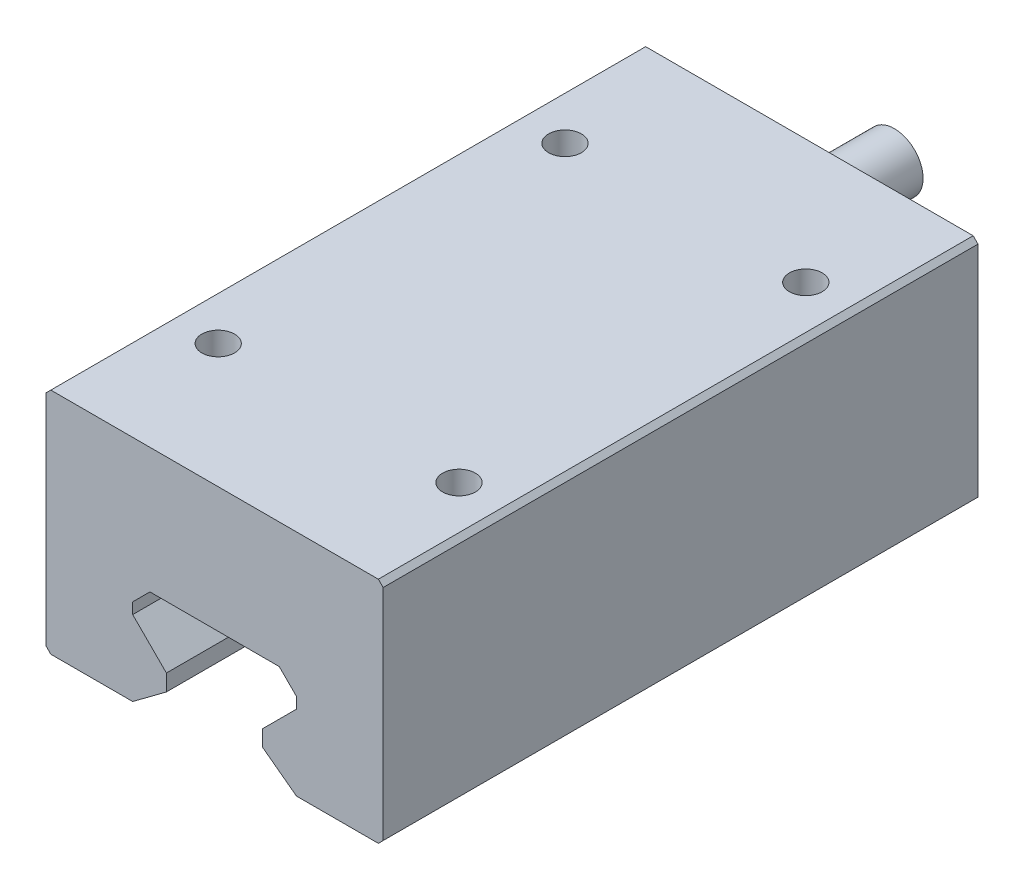
ISO-10303-21;
HEADER;
FILE_DESCRIPTION(('STEP AP214'),'2;1');
FILE_NAME('part.step','',(''),(''),'','','');
FILE_SCHEMA(('AUTOMOTIVE_DESIGN { 1 0 10303 214 1 1 1 1 }'));
ENDSEC;
DATA;
#1=APPLICATION_CONTEXT('core data for automotive mechanical design processes');
#2=APPLICATION_PROTOCOL_DEFINITION('international standard','automotive_design',2000,#1);
#3=PRODUCT_CONTEXT('',#1,'mechanical');
#4=PRODUCT('Part','Part','',(#3));
#5=PRODUCT_RELATED_PRODUCT_CATEGORY('part','',(#4));
#6=PRODUCT_DEFINITION_FORMATION('','',#4);
#7=PRODUCT_DEFINITION_CONTEXT('part definition',#1,'design');
#8=PRODUCT_DEFINITION('design','',#6,#7);
#9=PRODUCT_DEFINITION_SHAPE('','',#8);
#10=(LENGTH_UNIT() NAMED_UNIT(*) SI_UNIT(.MILLI.,.METRE.));
#11=(NAMED_UNIT(*) PLANE_ANGLE_UNIT() SI_UNIT($,.RADIAN.));
#12=(NAMED_UNIT(*) SI_UNIT($,.STERADIAN.) SOLID_ANGLE_UNIT());
#13=UNCERTAINTY_MEASURE_WITH_UNIT(LENGTH_MEASURE(1.E-05),#10,'distance_accuracy_value','');
#14=(GEOMETRIC_REPRESENTATION_CONTEXT(3) GLOBAL_UNCERTAINTY_ASSIGNED_CONTEXT((#13)) GLOBAL_UNIT_ASSIGNED_CONTEXT((#10,
#11,#12)) REPRESENTATION_CONTEXT('',''));
#15=CARTESIAN_POINT('',(0.,0.,0.));
#16=DIRECTION('',(0.,0.,1.));
#17=DIRECTION('',(1.,0.,0.));
#18=AXIS2_PLACEMENT_3D('',#15,#16,#17);
#19=CARTESIAN_POINT('',(10.,29.,0.));
#20=DIRECTION('',(0.,0.,-1.));
#21=DIRECTION('',(-1.,0.,0.));
#22=AXIS2_PLACEMENT_3D('',#19,#20,#21);
#23=PLANE('',#22);
#24=DIRECTION('',(0.,-1.,0.));
#25=VECTOR('',#24,1.);
#26=CARTESIAN_POINT('',(-35.,7.49999999999999,0.));
#27=LINE('',#26,#25);
#28=CARTESIAN_POINT('',(-35.,54.,0.));
#29=VERTEX_POINT('',#28);
#30=CARTESIAN_POINT('',(-35.,8.49999999999999,0.));
#31=VERTEX_POINT('',#30);
#32=EDGE_CURVE('E281',#29,#31,#27,.T.);
#33=ORIENTED_EDGE('',*,*,#32,.F.);
#34=DIRECTION('',(-0.707106781186548,-0.707106781186548,0.));
#35=VECTOR('',#34,1.);
#36=CARTESIAN_POINT('',(-25.,64.,0.));
#37=LINE('',#36,#35);
#38=CARTESIAN_POINT('',(-34.,55.,0.));
#39=VERTEX_POINT('',#38);
#40=EDGE_CURVE('E341',#29,#39,#37,.F.);
#41=ORIENTED_EDGE('',*,*,#40,.T.);
#42=DIRECTION('',(-1.,0.,0.));
#43=VECTOR('',#42,1.);
#44=CARTESIAN_POINT('',(-35.,55.,0.));
#45=LINE('',#44,#43);
#46=CARTESIAN_POINT('',(34.,55.,0.));
#47=VERTEX_POINT('',#46);
#48=EDGE_CURVE('E278',#47,#39,#45,.T.);
#49=ORIENTED_EDGE('',*,*,#48,.F.);
#50=DIRECTION('',(-0.707106781186548,0.707106781186548,0.));
#51=VECTOR('',#50,1.);
#52=CARTESIAN_POINT('',(35.,54.,0.));
#53=LINE('',#52,#51);
#54=CARTESIAN_POINT('',(35.,54.,0.));
#55=VERTEX_POINT('',#54);
#56=EDGE_CURVE('E335',#47,#55,#53,.F.);
#57=ORIENTED_EDGE('',*,*,#56,.T.);
#58=DIRECTION('',(0.,1.,0.));
#59=VECTOR('',#58,1.);
#60=CARTESIAN_POINT('',(35.,55.,0.));
#61=LINE('',#60,#59);
#62=CARTESIAN_POINT('',(35.,8.49999999999999,0.));
#63=VERTEX_POINT('',#62);
#64=EDGE_CURVE('E276',#63,#55,#61,.T.);
#65=ORIENTED_EDGE('',*,*,#64,.F.);
#66=DIRECTION('',(0.707106781186553,0.707106781186542,0.));
#67=VECTOR('',#66,1.);
#68=CARTESIAN_POINT('',(32.7499999999998,6.24999999999984,0.));
#69=LINE('',#68,#67);
#70=CARTESIAN_POINT('',(34.,7.5,0.));
#71=VERTEX_POINT('',#70);
#72=EDGE_CURVE('E337',#63,#71,#69,.F.);
#73=ORIENTED_EDGE('',*,*,#72,.T.);
#74=DIRECTION('',(1.,0.,0.));
#75=VECTOR('',#74,1.);
#76=CARTESIAN_POINT('',(35.,7.5,0.));
#77=LINE('',#76,#75);
#78=CARTESIAN_POINT('',(17.,7.5,0.));
#79=VERTEX_POINT('',#78);
#80=EDGE_CURVE('E273',#79,#71,#77,.T.);
#81=ORIENTED_EDGE('',*,*,#80,.F.);
#82=DIRECTION('',(0.801570617283295,-0.597900113320008,0.));
#83=VECTOR('',#82,1.);
#84=CARTESIAN_POINT('',(17.,7.5,0.));
#85=LINE('',#84,#83);
#86=CARTESIAN_POINT('',(10.,12.7213750142501,0.));
#87=VERTEX_POINT('',#86);
#88=EDGE_CURVE('E271',#87,#79,#85,.T.);
#89=ORIENTED_EDGE('',*,*,#88,.F.);
#90=DIRECTION('',(0.,-1.,0.));
#91=VECTOR('',#90,1.);
#92=CARTESIAN_POINT('',(10.,12.7213750142501,0.));
#93=LINE('',#92,#91);
#94=CARTESIAN_POINT('',(10.,16.1299077981946,0.));
#95=VERTEX_POINT('',#94);
#96=EDGE_CURVE('E269',#95,#87,#93,.T.);
#97=ORIENTED_EDGE('',*,*,#96,.F.);
#98=DIRECTION('',(-0.70710678118655,-0.707106781186546,0.));
#99=VECTOR('',#98,1.);
#100=CARTESIAN_POINT('',(10.,16.1299077981946,0.));
#101=LINE('',#100,#99);
#102=CARTESIAN_POINT('',(17.,23.1299077981945,0.));
#103=VERTEX_POINT('',#102);
#104=EDGE_CURVE('E267',#103,#95,#101,.T.);
#105=ORIENTED_EDGE('',*,*,#104,.F.);
#106=DIRECTION('',(0.,-1.,0.));
#107=VECTOR('',#106,1.);
#108=CARTESIAN_POINT('',(17.,23.1299077981945,0.));
#109=LINE('',#108,#107);
#110=CARTESIAN_POINT('',(17.,25.4259062998612,0.));
#111=VERTEX_POINT('',#110);
#112=EDGE_CURVE('E265',#111,#103,#109,.T.);
#113=ORIENTED_EDGE('',*,*,#112,.F.);
#114=DIRECTION('',(0.70710678118655,-0.707106781186545,0.));
#115=VECTOR('',#114,1.);
#116=CARTESIAN_POINT('',(17.,25.4259062998612,0.));
#117=LINE('',#116,#115);
#118=CARTESIAN_POINT('',(13.4259062998612,29.,0.));
#119=VERTEX_POINT('',#118);
#120=EDGE_CURVE('E263',#119,#111,#117,.T.);
#121=ORIENTED_EDGE('',*,*,#120,.F.);
#122=DIRECTION('',(1.,0.,0.));
#123=VECTOR('',#122,1.);
#124=CARTESIAN_POINT('',(13.4259062998612,29.,0.));
#125=LINE('',#124,#123);
#126=CARTESIAN_POINT('',(-13.4259062998611,29.,0.));
#127=VERTEX_POINT('',#126);
#128=EDGE_CURVE('E223',#127,#119,#125,.T.);
#129=ORIENTED_EDGE('',*,*,#128,.F.);
#130=DIRECTION('',(0.707106781186553,0.707106781186542,0.));
#131=VECTOR('',#130,1.);
#132=CARTESIAN_POINT('',(-13.4259062998611,29.,0.));
#133=LINE('',#132,#131);
#134=CARTESIAN_POINT('',(-17.,25.4259062998612,0.));
#135=VERTEX_POINT('',#134);
#136=EDGE_CURVE('E228',#135,#127,#133,.T.);
#137=ORIENTED_EDGE('',*,*,#136,.F.);
#138=DIRECTION('',(0.,1.,0.));
#139=VECTOR('',#138,1.);
#140=CARTESIAN_POINT('',(-17.,25.4259062998612,0.));
#141=LINE('',#140,#139);
#142=CARTESIAN_POINT('',(-17.,23.1299077981946,0.));
#143=VERTEX_POINT('',#142);
#144=EDGE_CURVE('E292',#143,#135,#141,.T.);
#145=ORIENTED_EDGE('',*,*,#144,.F.);
#146=DIRECTION('',(-0.707106781186548,0.707106781186547,0.));
#147=VECTOR('',#146,1.);
#148=CARTESIAN_POINT('',(-17.,23.1299077981946,0.));
#149=LINE('',#148,#147);
#150=CARTESIAN_POINT('',(-10.,16.1299077981946,0.));
#151=VERTEX_POINT('',#150);
#152=EDGE_CURVE('E290',#151,#143,#149,.T.);
#153=ORIENTED_EDGE('',*,*,#152,.F.);
#154=DIRECTION('',(0.,1.,0.));
#155=VECTOR('',#154,1.);
#156=CARTESIAN_POINT('',(-10.,16.1299077981946,0.));
#157=LINE('',#156,#155);
#158=CARTESIAN_POINT('',(-10.,12.7213750142501,0.));
#159=VERTEX_POINT('',#158);
#160=EDGE_CURVE('E288',#159,#151,#157,.T.);
#161=ORIENTED_EDGE('',*,*,#160,.F.);
#162=DIRECTION('',(0.801570617283295,0.597900113320008,0.));
#163=VECTOR('',#162,1.);
#164=CARTESIAN_POINT('',(-10.,12.7213750142501,0.));
#165=LINE('',#164,#163);
#166=CARTESIAN_POINT('',(-17.,7.5,0.));
#167=VERTEX_POINT('',#166);
#168=EDGE_CURVE('E286',#167,#159,#165,.T.);
#169=ORIENTED_EDGE('',*,*,#168,.F.);
#170=DIRECTION('',(1.,0.,0.));
#171=VECTOR('',#170,1.);
#172=CARTESIAN_POINT('',(-17.,7.5,0.));
#173=LINE('',#172,#171);
#174=CARTESIAN_POINT('',(-34.,7.49999999999999,0.));
#175=VERTEX_POINT('',#174);
#176=EDGE_CURVE('E284',#175,#167,#173,.T.);
#177=ORIENTED_EDGE('',*,*,#176,.F.);
#178=DIRECTION('',(0.707106781186548,-0.707106781186548,0.));
#179=VECTOR('',#178,1.);
#180=CARTESIAN_POINT('',(-22.75,-3.75000000000003,0.));
#181=LINE('',#180,#179);
#182=EDGE_CURVE('E339',#175,#31,#181,.F.);
#183=ORIENTED_EDGE('',*,*,#182,.T.);
#184=EDGE_LOOP('',(#33,#41,#49,#57,#65,#73,#81,#89,#97,#105,#113,#121,#129,#137,#145,#153,#161,
#169,#177,#183));
#185=FACE_BOUND('',#184,.T.);
#186=CARTESIAN_POINT('',(2.03758314148672,44.5184659444919,0.));
#187=DIRECTION('',(0.,0.,-1.));
#188=DIRECTION('',(-1.,0.,0.));
#189=AXIS2_PLACEMENT_3D('',#186,#187,#188);
#190=CIRCLE('',#189,5.96145320089348);
#191=CARTESIAN_POINT('',(-3.92387005940676,44.5184659444919,0.));
#192=VERTEX_POINT('',#191);
#193=EDGE_CURVE('E202',#192,#192,#190,.T.);
#194=ORIENTED_EDGE('',*,*,#193,.F.);
#195=EDGE_LOOP('',(#194));
#196=FACE_BOUND('',#195,.T.);
#197=ADVANCED_FACE('F36',(#185,#196),#23,.T.);
#198=CARTESIAN_POINT('',(13.4259062998612,29.,123.5));
#199=DIRECTION('',(0.,1.,0.));
#200=DIRECTION('',(-1.,0.,0.));
#201=AXIS2_PLACEMENT_3D('',#198,#199,#200);
#202=PLANE('',#201);
#203=ORIENTED_EDGE('',*,*,#128,.T.);
#204=DIRECTION('',(0.,0.,-1.));
#205=VECTOR('',#204,1.);
#206=CARTESIAN_POINT('',(13.4259062998612,29.,123.5));
#207=LINE('',#206,#205);
#208=CARTESIAN_POINT('',(13.4259062998612,29.,123.5));
#209=VERTEX_POINT('',#208);
#210=EDGE_CURVE('E327',#209,#119,#207,.T.);
#211=ORIENTED_EDGE('',*,*,#210,.F.);
#212=DIRECTION('',(1.,0.,0.));
#213=VECTOR('',#212,1.);
#214=CARTESIAN_POINT('',(13.4259062998612,29.,123.5));
#215=LINE('',#214,#213);
#216=CARTESIAN_POINT('',(-13.4259062998611,29.,123.5));
#217=VERTEX_POINT('',#216);
#218=EDGE_CURVE('E224',#217,#209,#215,.T.);
#219=ORIENTED_EDGE('',*,*,#218,.F.);
#220=DIRECTION('',(0.,0.,-1.));
#221=VECTOR('',#220,1.);
#222=CARTESIAN_POINT('',(-13.4259062998611,29.,123.5));
#223=LINE('',#222,#221);
#224=EDGE_CURVE('E260',#217,#127,#223,.T.);
#225=ORIENTED_EDGE('',*,*,#224,.T.);
#226=EDGE_LOOP('',(#203,#211,#219,#225));
#227=FACE_BOUND('',#226,.T.);
#228=ADVANCED_FACE('F421',(#227),#202,.F.);
#229=CARTESIAN_POINT('',(17.,25.4259062998612,123.5));
#230=DIRECTION('',(0.707106781186545,0.70710678118655,0.));
#231=DIRECTION('',(-0.70710678118655,0.707106781186545,0.));
#232=AXIS2_PLACEMENT_3D('',#229,#230,#231);
#233=PLANE('',#232);
#234=ORIENTED_EDGE('',*,*,#120,.T.);
#235=DIRECTION('',(0.,0.,-1.));
#236=VECTOR('',#235,1.);
#237=CARTESIAN_POINT('',(17.,25.4259062998612,123.5));
#238=LINE('',#237,#236);
#239=CARTESIAN_POINT('',(17.,25.4259062998612,123.5));
#240=VERTEX_POINT('',#239);
#241=EDGE_CURVE('E324',#240,#111,#238,.T.);
#242=ORIENTED_EDGE('',*,*,#241,.F.);
#243=DIRECTION('',(0.70710678118655,-0.707106781186545,0.));
#244=VECTOR('',#243,1.);
#245=CARTESIAN_POINT('',(17.,25.4259062998612,123.5));
#246=LINE('',#245,#244);
#247=EDGE_CURVE('E227',#209,#240,#246,.T.);
#248=ORIENTED_EDGE('',*,*,#247,.F.);
#249=ORIENTED_EDGE('',*,*,#210,.T.);
#250=EDGE_LOOP('',(#234,#242,#248,#249));
#251=FACE_BOUND('',#250,.T.);
#252=ADVANCED_FACE('F426',(#251),#233,.F.);
#253=CARTESIAN_POINT('',(17.,23.1299077981945,123.5));
#254=DIRECTION('',(1.,0.,0.));
#255=DIRECTION('',(0.,0.,-1.));
#256=AXIS2_PLACEMENT_3D('',#253,#254,#255);
#257=PLANE('',#256);
#258=ORIENTED_EDGE('',*,*,#112,.T.);
#259=DIRECTION('',(0.,0.,-1.));
#260=VECTOR('',#259,1.);
#261=CARTESIAN_POINT('',(17.,23.1299077981945,123.5));
#262=LINE('',#261,#260);
#263=CARTESIAN_POINT('',(17.,23.1299077981945,123.5));
#264=VERTEX_POINT('',#263);
#265=EDGE_CURVE('E321',#264,#103,#262,.T.);
#266=ORIENTED_EDGE('',*,*,#265,.F.);
#267=DIRECTION('',(0.,-1.,0.));
#268=VECTOR('',#267,1.);
#269=CARTESIAN_POINT('',(17.,23.1299077981945,123.5));
#270=LINE('',#269,#268);
#271=EDGE_CURVE('E230',#240,#264,#270,.T.);
#272=ORIENTED_EDGE('',*,*,#271,.F.);
#273=ORIENTED_EDGE('',*,*,#241,.T.);
#274=EDGE_LOOP('',(#258,#266,#272,#273));
#275=FACE_BOUND('',#274,.T.);
#276=ADVANCED_FACE('F429',(#275),#257,.F.);
#277=CARTESIAN_POINT('',(10.,16.1299077981946,123.5));
#278=DIRECTION('',(0.707106781186546,-0.70710678118655,0.));
#279=DIRECTION('',(0.70710678118655,0.707106781186546,0.));
#280=AXIS2_PLACEMENT_3D('',#277,#278,#279);
#281=PLANE('',#280);
#282=ORIENTED_EDGE('',*,*,#104,.T.);
#283=DIRECTION('',(0.,0.,-1.));
#284=VECTOR('',#283,1.);
#285=CARTESIAN_POINT('',(10.,16.1299077981946,123.5));
#286=LINE('',#285,#284);
#287=CARTESIAN_POINT('',(10.,16.1299077981946,123.5));
#288=VERTEX_POINT('',#287);
#289=EDGE_CURVE('E318',#288,#95,#286,.T.);
#290=ORIENTED_EDGE('',*,*,#289,.F.);
#291=DIRECTION('',(-0.70710678118655,-0.707106781186546,0.));
#292=VECTOR('',#291,1.);
#293=CARTESIAN_POINT('',(10.,16.1299077981946,123.5));
#294=LINE('',#293,#292);
#295=EDGE_CURVE('E232',#264,#288,#294,.T.);
#296=ORIENTED_EDGE('',*,*,#295,.F.);
#297=ORIENTED_EDGE('',*,*,#265,.T.);
#298=EDGE_LOOP('',(#282,#290,#296,#297));
#299=FACE_BOUND('',#298,.T.);
#300=ADVANCED_FACE('F434',(#299),#281,.F.);
#301=CARTESIAN_POINT('',(10.,12.7213750142501,123.5));
#302=DIRECTION('',(1.,0.,0.));
#303=DIRECTION('',(0.,0.,-1.));
#304=AXIS2_PLACEMENT_3D('',#301,#302,#303);
#305=PLANE('',#304);
#306=ORIENTED_EDGE('',*,*,#96,.T.);
#307=DIRECTION('',(0.,0.,-1.));
#308=VECTOR('',#307,1.);
#309=CARTESIAN_POINT('',(10.,12.7213750142501,123.5));
#310=LINE('',#309,#308);
#311=CARTESIAN_POINT('',(10.,12.7213750142501,123.5));
#312=VERTEX_POINT('',#311);
#313=EDGE_CURVE('E315',#312,#87,#310,.T.);
#314=ORIENTED_EDGE('',*,*,#313,.F.);
#315=DIRECTION('',(0.,-1.,0.));
#316=VECTOR('',#315,1.);
#317=CARTESIAN_POINT('',(10.,12.7213750142501,123.5));
#318=LINE('',#317,#316);
#319=EDGE_CURVE('E234',#288,#312,#318,.T.);
#320=ORIENTED_EDGE('',*,*,#319,.F.);
#321=ORIENTED_EDGE('',*,*,#289,.T.);
#322=EDGE_LOOP('',(#306,#314,#320,#321));
#323=FACE_BOUND('',#322,.T.);
#324=ADVANCED_FACE('F440',(#323),#305,.F.);
#325=CARTESIAN_POINT('',(17.,7.5,123.5));
#326=DIRECTION('',(0.597900113320008,0.801570617283295,0.));
#327=DIRECTION('',(-0.801570617283295,0.597900113320008,0.));
#328=AXIS2_PLACEMENT_3D('',#325,#326,#327);
#329=PLANE('',#328);
#330=ORIENTED_EDGE('',*,*,#88,.T.);
#331=DIRECTION('',(0.,0.,-1.));
#332=VECTOR('',#331,1.);
#333=CARTESIAN_POINT('',(17.,7.5,123.5));
#334=LINE('',#333,#332);
#335=CARTESIAN_POINT('',(17.,7.5,123.5));
#336=VERTEX_POINT('',#335);
#337=EDGE_CURVE('E312',#336,#79,#334,.T.);
#338=ORIENTED_EDGE('',*,*,#337,.F.);
#339=DIRECTION('',(0.801570617283295,-0.597900113320008,0.));
#340=VECTOR('',#339,1.);
#341=CARTESIAN_POINT('',(17.,7.5,123.5));
#342=LINE('',#341,#340);
#343=EDGE_CURVE('E236',#312,#336,#342,.T.);
#344=ORIENTED_EDGE('',*,*,#343,.F.);
#345=ORIENTED_EDGE('',*,*,#313,.T.);
#346=EDGE_LOOP('',(#330,#338,#344,#345));
#347=FACE_BOUND('',#346,.T.);
#348=ADVANCED_FACE('F444',(#347),#329,.F.);
#349=CARTESIAN_POINT('',(35.,7.5,123.5));
#350=DIRECTION('',(0.,1.,0.));
#351=DIRECTION('',(-1.,0.,0.));
#352=AXIS2_PLACEMENT_3D('',#349,#350,#351);
#353=PLANE('',#352);
#354=ORIENTED_EDGE('',*,*,#80,.T.);
#355=DIRECTION('',(0.,0.,1.));
#356=VECTOR('',#355,1.);
#357=CARTESIAN_POINT('',(34.,7.5,123.5));
#358=LINE('',#357,#356);
#359=CARTESIAN_POINT('',(34.,7.5,123.5));
#360=VERTEX_POINT('',#359);
#361=EDGE_CURVE('E11',#71,#360,#358,.T.);
#362=ORIENTED_EDGE('',*,*,#361,.T.);
#363=DIRECTION('',(1.,0.,0.));
#364=VECTOR('',#363,1.);
#365=CARTESIAN_POINT('',(35.,7.5,123.5));
#366=LINE('',#365,#364);
#367=EDGE_CURVE('E238',#336,#360,#366,.T.);
#368=ORIENTED_EDGE('',*,*,#367,.F.);
#369=ORIENTED_EDGE('',*,*,#337,.T.);
#370=EDGE_LOOP('',(#354,#362,#368,#369));
#371=FACE_BOUND('',#370,.T.);
#372=ADVANCED_FACE('F447',(#371),#353,.F.);
#373=CARTESIAN_POINT('',(35.,55.,123.5));
#374=DIRECTION('',(-1.,0.,0.));
#375=DIRECTION('',(0.,0.,1.));
#376=AXIS2_PLACEMENT_3D('',#373,#374,#375);
#377=PLANE('',#376);
#378=DIRECTION('',(0.,1.,0.));
#379=VECTOR('',#378,1.);
#380=CARTESIAN_POINT('',(35.,55.,123.5));
#381=LINE('',#380,#379);
#382=CARTESIAN_POINT('',(35.,8.49999999999999,123.5));
#383=VERTEX_POINT('',#382);
#384=CARTESIAN_POINT('',(35.,54.,123.5));
#385=VERTEX_POINT('',#384);
#386=EDGE_CURVE('E241',#383,#385,#381,.T.);
#387=ORIENTED_EDGE('',*,*,#386,.F.);
#388=DIRECTION('',(0.,0.,-1.));
#389=VECTOR('',#388,1.);
#390=CARTESIAN_POINT('',(35.,8.49999999999999,123.5));
#391=LINE('',#390,#389);
#392=EDGE_CURVE('E44',#383,#63,#391,.T.);
#393=ORIENTED_EDGE('',*,*,#392,.T.);
#394=ORIENTED_EDGE('',*,*,#64,.T.);
#395=DIRECTION('',(0.,0.,1.));
#396=VECTOR('',#395,1.);
#397=CARTESIAN_POINT('',(35.,54.,123.5));
#398=LINE('',#397,#396);
#399=EDGE_CURVE('E59',#55,#385,#398,.T.);
#400=ORIENTED_EDGE('',*,*,#399,.T.);
#401=EDGE_LOOP('',(#387,#393,#394,#400));
#402=FACE_BOUND('',#401,.T.);
#403=ADVANCED_FACE('F361',(#402),#377,.F.);
#404=CARTESIAN_POINT('',(-35.,55.,123.5));
#405=DIRECTION('',(0.,-1.,0.));
#406=DIRECTION('',(1.,0.,0.));
#407=AXIS2_PLACEMENT_3D('',#404,#405,#406);
#408=PLANE('',#407);
#409=CARTESIAN_POINT('',(-25.,55.,97.75));
#410=DIRECTION('',(0.,1.,0.));
#411=DIRECTION('',(0.,0.,1.));
#412=AXIS2_PLACEMENT_3D('',#409,#410,#411);
#413=CIRCLE('',#412,3.39999999999999);
#414=CARTESIAN_POINT('',(-25.,55.,101.15));
#415=VERTEX_POINT('',#414);
#416=EDGE_CURVE('E195',#415,#415,#413,.T.);
#417=ORIENTED_EDGE('',*,*,#416,.F.);
#418=EDGE_LOOP('',(#417));
#419=FACE_BOUND('',#418,.T.);
#420=CARTESIAN_POINT('',(-25.,55.,25.75));
#421=DIRECTION('',(0.,1.,0.));
#422=DIRECTION('',(0.,0.,1.));
#423=AXIS2_PLACEMENT_3D('',#420,#421,#422);
#424=CIRCLE('',#423,3.39999999999999);
#425=CARTESIAN_POINT('',(-25.,55.,29.15));
#426=VERTEX_POINT('',#425);
#427=EDGE_CURVE('E208',#426,#426,#424,.T.);
#428=ORIENTED_EDGE('',*,*,#427,.F.);
#429=EDGE_LOOP('',(#428));
#430=FACE_BOUND('',#429,.T.);
#431=CARTESIAN_POINT('',(25.,55.,25.75));
#432=DIRECTION('',(0.,1.,0.));
#433=DIRECTION('',(0.,0.,1.));
#434=AXIS2_PLACEMENT_3D('',#431,#432,#433);
#435=CIRCLE('',#434,3.39999999999999);
#436=CARTESIAN_POINT('',(25.,55.,29.15));
#437=VERTEX_POINT('',#436);
#438=EDGE_CURVE('E214',#437,#437,#435,.T.);
#439=ORIENTED_EDGE('',*,*,#438,.F.);
#440=EDGE_LOOP('',(#439));
#441=FACE_BOUND('',#440,.T.);
#442=CARTESIAN_POINT('',(25.,55.,97.75));
#443=DIRECTION('',(0.,1.,0.));
#444=DIRECTION('',(0.,0.,1.));
#445=AXIS2_PLACEMENT_3D('',#442,#443,#444);
#446=CIRCLE('',#445,3.39999999999999);
#447=CARTESIAN_POINT('',(25.,55.,101.15));
#448=VERTEX_POINT('',#447);
#449=EDGE_CURVE('E220',#448,#448,#446,.T.);
#450=ORIENTED_EDGE('',*,*,#449,.F.);
#451=EDGE_LOOP('',(#450));
#452=FACE_BOUND('',#451,.T.);
#453=ORIENTED_EDGE('',*,*,#48,.T.);
#454=DIRECTION('',(0.,0.,1.));
#455=VECTOR('',#454,1.);
#456=CARTESIAN_POINT('',(-34.,55.,123.5));
#457=LINE('',#456,#455);
#458=CARTESIAN_POINT('',(-34.,55.,123.5));
#459=VERTEX_POINT('',#458);
#460=EDGE_CURVE('E346',#39,#459,#457,.T.);
#461=ORIENTED_EDGE('',*,*,#460,.T.);
#462=DIRECTION('',(-1.,0.,0.));
#463=VECTOR('',#462,1.);
#464=CARTESIAN_POINT('',(-35.,55.,123.5));
#465=LINE('',#464,#463);
#466=CARTESIAN_POINT('',(34.,55.,123.5));
#467=VERTEX_POINT('',#466);
#468=EDGE_CURVE('E243',#467,#459,#465,.T.);
#469=ORIENTED_EDGE('',*,*,#468,.F.);
#470=DIRECTION('',(0.,0.,-1.));
#471=VECTOR('',#470,1.);
#472=CARTESIAN_POINT('',(34.,55.,123.5));
#473=LINE('',#472,#471);
#474=EDGE_CURVE('E343',#467,#47,#473,.T.);
#475=ORIENTED_EDGE('',*,*,#474,.T.);
#476=EDGE_LOOP('',(#453,#461,#469,#475));
#477=FACE_BOUND('',#476,.T.);
#478=ADVANCED_FACE('F374',(#419,#430,#441,#452,#477),#408,.F.);
#479=CARTESIAN_POINT('',(-35.,7.49999999999999,123.5));
#480=DIRECTION('',(1.,0.,0.));
#481=DIRECTION('',(0.,0.,-1.));
#482=AXIS2_PLACEMENT_3D('',#479,#480,#481);
#483=PLANE('',#482);
#484=DIRECTION('',(0.,-1.,0.));
#485=VECTOR('',#484,1.);
#486=CARTESIAN_POINT('',(-35.,7.49999999999999,123.5));
#487=LINE('',#486,#485);
#488=CARTESIAN_POINT('',(-35.,54.,123.5));
#489=VERTEX_POINT('',#488);
#490=CARTESIAN_POINT('',(-35.,8.49999999999999,123.5));
#491=VERTEX_POINT('',#490);
#492=EDGE_CURVE('E246',#489,#491,#487,.T.);
#493=ORIENTED_EDGE('',*,*,#492,.F.);
#494=DIRECTION('',(0.,0.,-1.));
#495=VECTOR('',#494,1.);
#496=CARTESIAN_POINT('',(-35.,54.,123.5));
#497=LINE('',#496,#495);
#498=EDGE_CURVE('E332',#489,#29,#497,.T.);
#499=ORIENTED_EDGE('',*,*,#498,.T.);
#500=ORIENTED_EDGE('',*,*,#32,.T.);
#501=DIRECTION('',(0.,0.,1.));
#502=VECTOR('',#501,1.);
#503=CARTESIAN_POINT('',(-35.,8.49999999999999,123.5));
#504=LINE('',#503,#502);
#505=EDGE_CURVE('E330',#31,#491,#504,.T.);
#506=ORIENTED_EDGE('',*,*,#505,.T.);
#507=EDGE_LOOP('',(#493,#499,#500,#506));
#508=FACE_BOUND('',#507,.T.);
#509=ADVANCED_FACE('F383',(#508),#483,.F.);
#510=CARTESIAN_POINT('',(-17.,7.5,123.5));
#511=DIRECTION('',(0.,1.,0.));
#512=DIRECTION('',(-1.,0.,0.));
#513=AXIS2_PLACEMENT_3D('',#510,#511,#512);
#514=PLANE('',#513);
#515=DIRECTION('',(1.,0.,0.));
#516=VECTOR('',#515,1.);
#517=CARTESIAN_POINT('',(-17.,7.5,123.5));
#518=LINE('',#517,#516);
#519=CARTESIAN_POINT('',(-34.,7.49999999999999,123.5));
#520=VERTEX_POINT('',#519);
#521=CARTESIAN_POINT('',(-17.,7.5,123.5));
#522=VERTEX_POINT('',#521);
#523=EDGE_CURVE('E248',#520,#522,#518,.T.);
#524=ORIENTED_EDGE('',*,*,#523,.F.);
#525=DIRECTION('',(0.,0.,-1.));
#526=VECTOR('',#525,1.);
#527=CARTESIAN_POINT('',(-34.,7.49999999999999,123.5));
#528=LINE('',#527,#526);
#529=EDGE_CURVE('E355',#520,#175,#528,.T.);
#530=ORIENTED_EDGE('',*,*,#529,.T.);
#531=ORIENTED_EDGE('',*,*,#176,.T.);
#532=DIRECTION('',(0.,0.,-1.));
#533=VECTOR('',#532,1.);
#534=CARTESIAN_POINT('',(-17.,7.5,123.5));
#535=LINE('',#534,#533);
#536=EDGE_CURVE('E309',#522,#167,#535,.T.);
#537=ORIENTED_EDGE('',*,*,#536,.F.);
#538=EDGE_LOOP('',(#524,#530,#531,#537));
#539=FACE_BOUND('',#538,.T.);
#540=ADVANCED_FACE('F391',(#539),#514,.F.);
#541=CARTESIAN_POINT('',(-10.,12.7213750142501,123.5));
#542=DIRECTION('',(-0.597900113320008,0.801570617283295,0.));
#543=DIRECTION('',(-0.801570617283295,-0.597900113320008,0.));
#544=AXIS2_PLACEMENT_3D('',#541,#542,#543);
#545=PLANE('',#544);
#546=ORIENTED_EDGE('',*,*,#168,.T.);
#547=DIRECTION('',(0.,0.,-1.));
#548=VECTOR('',#547,1.);
#549=CARTESIAN_POINT('',(-10.,12.7213750142501,123.5));
#550=LINE('',#549,#548);
#551=CARTESIAN_POINT('',(-10.,12.7213750142501,123.5));
#552=VERTEX_POINT('',#551);
#553=EDGE_CURVE('E306',#552,#159,#550,.T.);
#554=ORIENTED_EDGE('',*,*,#553,.F.);
#555=DIRECTION('',(0.801570617283295,0.597900113320008,0.));
#556=VECTOR('',#555,1.);
#557=CARTESIAN_POINT('',(-10.,12.7213750142501,123.5));
#558=LINE('',#557,#556);
#559=EDGE_CURVE('E250',#522,#552,#558,.T.);
#560=ORIENTED_EDGE('',*,*,#559,.F.);
#561=ORIENTED_EDGE('',*,*,#536,.T.);
#562=EDGE_LOOP('',(#546,#554,#560,#561));
#563=FACE_BOUND('',#562,.T.);
#564=ADVANCED_FACE('F398',(#563),#545,.F.);
#565=CARTESIAN_POINT('',(-10.,16.1299077981946,123.5));
#566=DIRECTION('',(-1.,0.,0.));
#567=DIRECTION('',(0.,-1.,0.));
#568=AXIS2_PLACEMENT_3D('',#565,#566,#567);
#569=PLANE('',#568);
#570=ORIENTED_EDGE('',*,*,#160,.T.);
#571=DIRECTION('',(0.,0.,-1.));
#572=VECTOR('',#571,1.);
#573=CARTESIAN_POINT('',(-10.,16.1299077981946,123.5));
#574=LINE('',#573,#572);
#575=CARTESIAN_POINT('',(-10.,16.1299077981946,123.5));
#576=VERTEX_POINT('',#575);
#577=EDGE_CURVE('E303',#576,#151,#574,.T.);
#578=ORIENTED_EDGE('',*,*,#577,.F.);
#579=DIRECTION('',(0.,1.,0.));
#580=VECTOR('',#579,1.);
#581=CARTESIAN_POINT('',(-10.,16.1299077981946,123.5));
#582=LINE('',#581,#580);
#583=EDGE_CURVE('E252',#552,#576,#582,.T.);
#584=ORIENTED_EDGE('',*,*,#583,.F.);
#585=ORIENTED_EDGE('',*,*,#553,.T.);
#586=EDGE_LOOP('',(#570,#578,#584,#585));
#587=FACE_BOUND('',#586,.T.);
#588=ADVANCED_FACE('F401',(#587),#569,.F.);
#589=CARTESIAN_POINT('',(-17.,23.1299077981946,123.5));
#590=DIRECTION('',(-0.707106781186547,-0.707106781186548,0.));
#591=DIRECTION('',(0.707106781186548,-0.707106781186547,0.));
#592=AXIS2_PLACEMENT_3D('',#589,#590,#591);
#593=PLANE('',#592);
#594=ORIENTED_EDGE('',*,*,#152,.T.);
#595=DIRECTION('',(0.,0.,-1.));
#596=VECTOR('',#595,1.);
#597=CARTESIAN_POINT('',(-17.,23.1299077981946,123.5));
#598=LINE('',#597,#596);
#599=CARTESIAN_POINT('',(-17.,23.1299077981946,123.5));
#600=VERTEX_POINT('',#599);
#601=EDGE_CURVE('E300',#600,#143,#598,.T.);
#602=ORIENTED_EDGE('',*,*,#601,.F.);
#603=DIRECTION('',(-0.707106781186548,0.707106781186547,0.));
#604=VECTOR('',#603,1.);
#605=CARTESIAN_POINT('',(-17.,23.1299077981946,123.5));
#606=LINE('',#605,#604);
#607=EDGE_CURVE('E254',#576,#600,#606,.T.);
#608=ORIENTED_EDGE('',*,*,#607,.F.);
#609=ORIENTED_EDGE('',*,*,#577,.T.);
#610=EDGE_LOOP('',(#594,#602,#608,#609));
#611=FACE_BOUND('',#610,.T.);
#612=ADVANCED_FACE('F406',(#611),#593,.F.);
#613=CARTESIAN_POINT('',(-17.,25.4259062998612,123.5));
#614=DIRECTION('',(-1.,0.,0.));
#615=DIRECTION('',(0.,-1.,0.));
#616=AXIS2_PLACEMENT_3D('',#613,#614,#615);
#617=PLANE('',#616);
#618=ORIENTED_EDGE('',*,*,#144,.T.);
#619=DIRECTION('',(0.,0.,-1.));
#620=VECTOR('',#619,1.);
#621=CARTESIAN_POINT('',(-17.,25.4259062998612,123.5));
#622=LINE('',#621,#620);
#623=CARTESIAN_POINT('',(-17.,25.4259062998612,123.5));
#624=VERTEX_POINT('',#623);
#625=EDGE_CURVE('E297',#624,#135,#622,.T.);
#626=ORIENTED_EDGE('',*,*,#625,.F.);
#627=DIRECTION('',(0.,1.,0.));
#628=VECTOR('',#627,1.);
#629=CARTESIAN_POINT('',(-17.,25.4259062998612,123.5));
#630=LINE('',#629,#628);
#631=EDGE_CURVE('E256',#600,#624,#630,.T.);
#632=ORIENTED_EDGE('',*,*,#631,.F.);
#633=ORIENTED_EDGE('',*,*,#601,.T.);
#634=EDGE_LOOP('',(#618,#626,#632,#633));
#635=FACE_BOUND('',#634,.T.);
#636=ADVANCED_FACE('F412',(#635),#617,.F.);
#637=CARTESIAN_POINT('',(-13.4259062998611,29.,123.5));
#638=DIRECTION('',(-0.707106781186542,0.707106781186553,0.));
#639=DIRECTION('',(-0.707106781186553,-0.707106781186542,0.));
#640=AXIS2_PLACEMENT_3D('',#637,#638,#639);
#641=PLANE('',#640);
#642=ORIENTED_EDGE('',*,*,#136,.T.);
#643=ORIENTED_EDGE('',*,*,#224,.F.);
#644=DIRECTION('',(0.707106781186553,0.707106781186542,0.));
#645=VECTOR('',#644,1.);
#646=CARTESIAN_POINT('',(-13.4259062998611,29.,123.5));
#647=LINE('',#646,#645);
#648=EDGE_CURVE('E258',#624,#217,#647,.T.);
#649=ORIENTED_EDGE('',*,*,#648,.F.);
#650=ORIENTED_EDGE('',*,*,#625,.T.);
#651=EDGE_LOOP('',(#642,#643,#649,#650));
#652=FACE_BOUND('',#651,.T.);
#653=ADVANCED_FACE('F416',(#652),#641,.F.);
#654=CARTESIAN_POINT('',(10.,29.,123.5));
#655=DIRECTION('',(0.,0.,-1.));
#656=DIRECTION('',(-1.,0.,0.));
#657=AXIS2_PLACEMENT_3D('',#654,#655,#656);
#658=PLANE('',#657);
#659=ORIENTED_EDGE('',*,*,#468,.T.);
#660=DIRECTION('',(0.707106781186548,0.707106781186548,0.));
#661=VECTOR('',#660,1.);
#662=CARTESIAN_POINT('',(-35.,54.,123.5));
#663=LINE('',#662,#661);
#664=EDGE_CURVE('E353',#459,#489,#663,.F.);
#665=ORIENTED_EDGE('',*,*,#664,.T.);
#666=ORIENTED_EDGE('',*,*,#492,.T.);
#667=DIRECTION('',(-0.707106781186548,0.707106781186548,0.));
#668=VECTOR('',#667,1.);
#669=CARTESIAN_POINT('',(-34.,7.49999999999999,123.5));
#670=LINE('',#669,#668);
#671=EDGE_CURVE('E51',#491,#520,#670,.F.);
#672=ORIENTED_EDGE('',*,*,#671,.T.);
#673=ORIENTED_EDGE('',*,*,#523,.T.);
#674=ORIENTED_EDGE('',*,*,#559,.T.);
#675=ORIENTED_EDGE('',*,*,#583,.T.);
#676=ORIENTED_EDGE('',*,*,#607,.T.);
#677=ORIENTED_EDGE('',*,*,#631,.T.);
#678=ORIENTED_EDGE('',*,*,#648,.T.);
#679=ORIENTED_EDGE('',*,*,#218,.T.);
#680=ORIENTED_EDGE('',*,*,#247,.T.);
#681=ORIENTED_EDGE('',*,*,#271,.T.);
#682=ORIENTED_EDGE('',*,*,#295,.T.);
#683=ORIENTED_EDGE('',*,*,#319,.T.);
#684=ORIENTED_EDGE('',*,*,#343,.T.);
#685=ORIENTED_EDGE('',*,*,#367,.T.);
#686=DIRECTION('',(-0.707106781186553,-0.707106781186542,0.));
#687=VECTOR('',#686,1.);
#688=CARTESIAN_POINT('',(35.,8.49999999999999,123.5));
#689=LINE('',#688,#687);
#690=EDGE_CURVE('E350',#360,#383,#689,.F.);
#691=ORIENTED_EDGE('',*,*,#690,.T.);
#692=ORIENTED_EDGE('',*,*,#386,.T.);
#693=DIRECTION('',(0.707106781186548,-0.707106781186548,0.));
#694=VECTOR('',#693,1.);
#695=CARTESIAN_POINT('',(34.,55.,123.5));
#696=LINE('',#695,#694);
#697=EDGE_CURVE('E348',#385,#467,#696,.F.);
#698=ORIENTED_EDGE('',*,*,#697,.T.);
#699=EDGE_LOOP('',(#659,#665,#666,#672,#673,#674,#675,#676,#677,#678,#679,#680,#681,#682,#683,
#684,#685,#691,#692,#698));
#700=FACE_BOUND('',#699,.T.);
#701=ADVANCED_FACE('F377',(#700),#658,.F.);
#702=CARTESIAN_POINT('',(-35.,54.,123.5));
#703=DIRECTION('',(0.707106781186547,-0.707106781186547,0.));
#704=DIRECTION('',(0.707106781186548,0.707106781186548,0.));
#705=AXIS2_PLACEMENT_3D('',#702,#703,#704);
#706=PLANE('',#705);
#707=ORIENTED_EDGE('',*,*,#664,.F.);
#708=ORIENTED_EDGE('',*,*,#460,.F.);
#709=ORIENTED_EDGE('',*,*,#40,.F.);
#710=ORIENTED_EDGE('',*,*,#498,.F.);
#711=EDGE_LOOP('',(#707,#708,#709,#710));
#712=FACE_BOUND('',#711,.T.);
#713=ADVANCED_FACE('F381',(#712),#706,.F.);
#714=CARTESIAN_POINT('',(-34.,7.49999999999999,123.5));
#715=DIRECTION('',(0.707106781186547,0.707106781186547,0.));
#716=DIRECTION('',(-0.707106781186548,0.707106781186548,0.));
#717=AXIS2_PLACEMENT_3D('',#714,#715,#716);
#718=PLANE('',#717);
#719=ORIENTED_EDGE('',*,*,#671,.F.);
#720=ORIENTED_EDGE('',*,*,#505,.F.);
#721=ORIENTED_EDGE('',*,*,#182,.F.);
#722=ORIENTED_EDGE('',*,*,#529,.F.);
#723=EDGE_LOOP('',(#719,#720,#721,#722));
#724=FACE_BOUND('',#723,.T.);
#725=ADVANCED_FACE('F389',(#724),#718,.F.);
#726=CARTESIAN_POINT('',(35.,8.49999999999999,123.5));
#727=DIRECTION('',(-0.707106781186542,0.707106781186553,0.));
#728=DIRECTION('',(-0.707106781186553,-0.707106781186542,0.));
#729=AXIS2_PLACEMENT_3D('',#726,#727,#728);
#730=PLANE('',#729);
#731=ORIENTED_EDGE('',*,*,#690,.F.);
#732=ORIENTED_EDGE('',*,*,#361,.F.);
#733=ORIENTED_EDGE('',*,*,#72,.F.);
#734=ORIENTED_EDGE('',*,*,#392,.F.);
#735=EDGE_LOOP('',(#731,#732,#733,#734));
#736=FACE_BOUND('',#735,.T.);
#737=ADVANCED_FACE('F449',(#736),#730,.F.);
#738=CARTESIAN_POINT('',(34.,55.,123.5));
#739=DIRECTION('',(-0.707106781186547,-0.707106781186547,0.));
#740=DIRECTION('',(0.707106781186548,-0.707106781186548,0.));
#741=AXIS2_PLACEMENT_3D('',#738,#739,#740);
#742=PLANE('',#741);
#743=ORIENTED_EDGE('',*,*,#697,.F.);
#744=ORIENTED_EDGE('',*,*,#399,.F.);
#745=ORIENTED_EDGE('',*,*,#56,.F.);
#746=ORIENTED_EDGE('',*,*,#474,.F.);
#747=EDGE_LOOP('',(#743,#744,#745,#746));
#748=FACE_BOUND('',#747,.T.);
#749=ADVANCED_FACE('F38',(#748),#742,.F.);
#750=CARTESIAN_POINT('',(25.,55.,97.75));
#751=DIRECTION('',(0.,1.,0.));
#752=DIRECTION('',(0.,0.,1.));
#753=AXIS2_PLACEMENT_3D('',#750,#751,#752);
#754=CYLINDRICAL_SURFACE('',#753,3.39999999999999);
#755=CARTESIAN_POINT('',(25.,40.,97.75));
#756=DIRECTION('',(0.,1.,0.));
#757=DIRECTION('',(0.,0.,1.));
#758=AXIS2_PLACEMENT_3D('',#755,#756,#757);
#759=CIRCLE('',#758,3.4);
#760=CARTESIAN_POINT('',(25.,40.,101.15));
#761=VERTEX_POINT('',#760);
#762=EDGE_CURVE('E217',#761,#761,#759,.T.);
#763=ORIENTED_EDGE('',*,*,#762,.F.);
#764=EDGE_LOOP('',(#763));
#765=FACE_BOUND('',#764,.T.);
#766=ORIENTED_EDGE('',*,*,#449,.T.);
#767=EDGE_LOOP('',(#766));
#768=FACE_BOUND('',#767,.T.);
#769=ADVANCED_FACE('F455',(#765,#768),#754,.F.);
#770=CARTESIAN_POINT('',(25.,40.,97.75));
#771=DIRECTION('',(0.,1.,0.));
#772=DIRECTION('',(0.,0.,1.));
#773=AXIS2_PLACEMENT_3D('',#770,#771,#772);
#774=CONICAL_SURFACE('',#773,3.4,1.02974425867665);
#775=CARTESIAN_POINT('',(25.,37.9570738953063,97.75));
#776=VERTEX_POINT('',#775);
#777=VERTEX_LOOP('',#776);
#778=FACE_BOUND('',#777,.T.);
#779=ORIENTED_EDGE('',*,*,#762,.T.);
#780=EDGE_LOOP('',(#779));
#781=FACE_BOUND('',#780,.T.);
#782=ADVANCED_FACE('F627',(#778,#781),#774,.F.);
#783=CARTESIAN_POINT('',(25.,55.,25.75));
#784=DIRECTION('',(0.,1.,0.));
#785=DIRECTION('',(0.,0.,1.));
#786=AXIS2_PLACEMENT_3D('',#783,#784,#785);
#787=CYLINDRICAL_SURFACE('',#786,3.39999999999999);
#788=CARTESIAN_POINT('',(25.,40.,25.75));
#789=DIRECTION('',(0.,1.,0.));
#790=DIRECTION('',(0.,0.,1.));
#791=AXIS2_PLACEMENT_3D('',#788,#789,#790);
#792=CIRCLE('',#791,3.4);
#793=CARTESIAN_POINT('',(25.,40.,29.15));
#794=VERTEX_POINT('',#793);
#795=EDGE_CURVE('E211',#794,#794,#792,.T.);
#796=ORIENTED_EDGE('',*,*,#795,.F.);
#797=EDGE_LOOP('',(#796));
#798=FACE_BOUND('',#797,.T.);
#799=ORIENTED_EDGE('',*,*,#438,.T.);
#800=EDGE_LOOP('',(#799));
#801=FACE_BOUND('',#800,.T.);
#802=ADVANCED_FACE('F636',(#798,#801),#787,.F.);
#803=CARTESIAN_POINT('',(25.,40.,25.75));
#804=DIRECTION('',(0.,1.,0.));
#805=DIRECTION('',(0.,0.,1.));
#806=AXIS2_PLACEMENT_3D('',#803,#804,#805);
#807=CONICAL_SURFACE('',#806,3.4,1.02974425867665);
#808=CARTESIAN_POINT('',(25.,37.9570738953063,25.75));
#809=VERTEX_POINT('',#808);
#810=VERTEX_LOOP('',#809);
#811=FACE_BOUND('',#810,.T.);
#812=ORIENTED_EDGE('',*,*,#795,.T.);
#813=EDGE_LOOP('',(#812));
#814=FACE_BOUND('',#813,.T.);
#815=ADVANCED_FACE('F645',(#811,#814),#807,.F.);
#816=CARTESIAN_POINT('',(-25.,55.,25.75));
#817=DIRECTION('',(0.,1.,0.));
#818=DIRECTION('',(0.,0.,1.));
#819=AXIS2_PLACEMENT_3D('',#816,#817,#818);
#820=CYLINDRICAL_SURFACE('',#819,3.39999999999999);
#821=CARTESIAN_POINT('',(-25.,40.,25.75));
#822=DIRECTION('',(0.,1.,0.));
#823=DIRECTION('',(0.,0.,1.));
#824=AXIS2_PLACEMENT_3D('',#821,#822,#823);
#825=CIRCLE('',#824,3.4);
#826=CARTESIAN_POINT('',(-25.,40.,29.15));
#827=VERTEX_POINT('',#826);
#828=EDGE_CURVE('E199',#827,#827,#825,.T.);
#829=ORIENTED_EDGE('',*,*,#828,.F.);
#830=EDGE_LOOP('',(#829));
#831=FACE_BOUND('',#830,.T.);
#832=ORIENTED_EDGE('',*,*,#427,.T.);
#833=EDGE_LOOP('',(#832));
#834=FACE_BOUND('',#833,.T.);
#835=ADVANCED_FACE('F655',(#831,#834),#820,.F.);
#836=CARTESIAN_POINT('',(-25.,40.,25.75));
#837=DIRECTION('',(0.,1.,0.));
#838=DIRECTION('',(0.,0.,1.));
#839=AXIS2_PLACEMENT_3D('',#836,#837,#838);
#840=CONICAL_SURFACE('',#839,3.4,1.02974425867665);
#841=CARTESIAN_POINT('',(-25.,37.9570738953063,25.75));
#842=VERTEX_POINT('',#841);
#843=VERTEX_LOOP('',#842);
#844=FACE_BOUND('',#843,.T.);
#845=ORIENTED_EDGE('',*,*,#828,.T.);
#846=EDGE_LOOP('',(#845));
#847=FACE_BOUND('',#846,.T.);
#848=ADVANCED_FACE('F664',(#844,#847),#840,.F.);
#849=CARTESIAN_POINT('',(-25.,55.,97.75));
#850=DIRECTION('',(0.,1.,0.));
#851=DIRECTION('',(0.,0.,1.));
#852=AXIS2_PLACEMENT_3D('',#849,#850,#851);
#853=CYLINDRICAL_SURFACE('',#852,3.39999999999999);
#854=CARTESIAN_POINT('',(-25.,40.,97.75));
#855=DIRECTION('',(0.,1.,0.));
#856=DIRECTION('',(0.,0.,1.));
#857=AXIS2_PLACEMENT_3D('',#854,#855,#856);
#858=CIRCLE('',#857,3.4);
#859=CARTESIAN_POINT('',(-25.,40.,101.15));
#860=VERTEX_POINT('',#859);
#861=EDGE_CURVE('E193',#860,#860,#858,.T.);
#862=ORIENTED_EDGE('',*,*,#861,.F.);
#863=EDGE_LOOP('',(#862));
#864=FACE_BOUND('',#863,.T.);
#865=ORIENTED_EDGE('',*,*,#416,.T.);
#866=EDGE_LOOP('',(#865));
#867=FACE_BOUND('',#866,.T.);
#868=ADVANCED_FACE('F189',(#864,#867),#853,.F.);
#869=CARTESIAN_POINT('',(-25.,40.,97.75));
#870=DIRECTION('',(0.,1.,0.));
#871=DIRECTION('',(0.,0.,1.));
#872=AXIS2_PLACEMENT_3D('',#869,#870,#871);
#873=CONICAL_SURFACE('',#872,3.4,1.02974425867665);
#874=CARTESIAN_POINT('',(-25.,37.9570738953063,97.75));
#875=VERTEX_POINT('',#874);
#876=VERTEX_LOOP('',#875);
#877=FACE_BOUND('',#876,.T.);
#878=ORIENTED_EDGE('',*,*,#861,.T.);
#879=EDGE_LOOP('',(#878));
#880=FACE_BOUND('',#879,.T.);
#881=ADVANCED_FACE('F185',(#877,#880),#873,.F.);
#882=CARTESIAN_POINT('',(2.03758314148672,44.5184659444919,-15.6));
#883=DIRECTION('',(0.,0.,1.));
#884=DIRECTION('',(1.,0.,0.));
#885=AXIS2_PLACEMENT_3D('',#882,#883,#884);
#886=CYLINDRICAL_SURFACE('',#885,5.96145320089348);
#887=CARTESIAN_POINT('',(2.03758314148672,44.5184659444919,-15.6));
#888=DIRECTION('',(0.,0.,-1.));
#889=DIRECTION('',(-1.,0.,0.));
#890=AXIS2_PLACEMENT_3D('',#887,#888,#889);
#891=CIRCLE('',#890,5.96145320089348);
#892=CARTESIAN_POINT('',(-3.92387005940676,44.5184659444919,-15.6));
#893=VERTEX_POINT('',#892);
#894=EDGE_CURVE('E196',#893,#893,#891,.T.);
#895=ORIENTED_EDGE('',*,*,#894,.F.);
#896=EDGE_LOOP('',(#895));
#897=FACE_BOUND('',#896,.T.);
#898=ORIENTED_EDGE('',*,*,#193,.T.);
#899=EDGE_LOOP('',(#898));
#900=FACE_BOUND('',#899,.T.);
#901=ADVANCED_FACE('F188',(#897,#900),#886,.T.);
#902=CARTESIAN_POINT('',(2.03758314148672,44.5184659444919,-15.6));
#903=DIRECTION('',(0.,0.,-1.));
#904=DIRECTION('',(-1.,0.,0.));
#905=AXIS2_PLACEMENT_3D('',#902,#903,#904);
#906=PLANE('',#905);
#907=ORIENTED_EDGE('',*,*,#894,.T.);
#908=EDGE_LOOP('',(#907));
#909=FACE_BOUND('',#908,.T.);
#910=ADVANCED_FACE('F699',(#909),#906,.T.);
#911=CLOSED_SHELL('',(#197,#228,#252,#276,#300,#324,#348,#372,#403,#478,#509,#540,#564,#588,
#612,#636,#653,#701,#713,#725,#737,#749,#769,#782,#802,#815,#835,#848,#868,#881,#901,#910));
#912=MANIFOLD_SOLID_BREP('B2',#911);
#913=ADVANCED_BREP_SHAPE_REPRESENTATION('',(#18,#912),#14);
#914=SHAPE_DEFINITION_REPRESENTATION(#9,#913);
ENDSEC;
END-ISO-10303-21;
